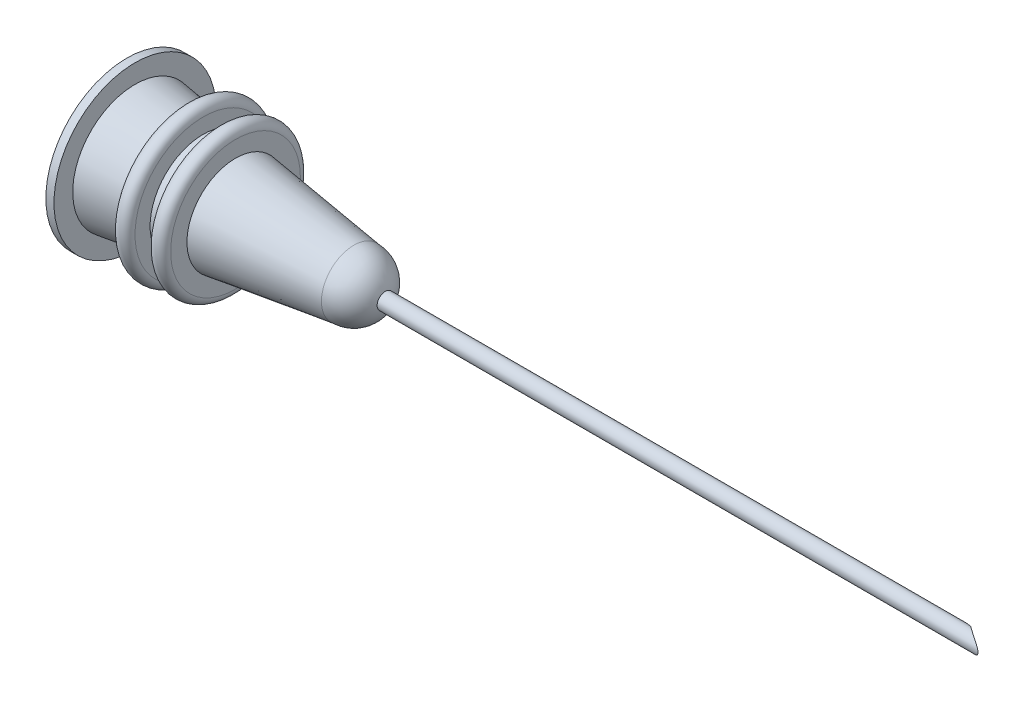
ISO-10303-21;
HEADER;
FILE_DESCRIPTION(('STEP AP214'),'2;1');
FILE_NAME('part.step','',(''),(''),'','','');
FILE_SCHEMA(('AUTOMOTIVE_DESIGN { 1 0 10303 214 1 1 1 1 }'));
ENDSEC;
DATA;
#1=APPLICATION_CONTEXT('core data for automotive mechanical design processes');
#2=APPLICATION_PROTOCOL_DEFINITION('international standard','automotive_design',2000,#1);
#3=PRODUCT_CONTEXT('',#1,'mechanical');
#4=PRODUCT('Part','Part','',(#3));
#5=PRODUCT_RELATED_PRODUCT_CATEGORY('part','',(#4));
#6=PRODUCT_DEFINITION_FORMATION('','',#4);
#7=PRODUCT_DEFINITION_CONTEXT('part definition',#1,'design');
#8=PRODUCT_DEFINITION('design','',#6,#7);
#9=PRODUCT_DEFINITION_SHAPE('','',#8);
#10=(LENGTH_UNIT() NAMED_UNIT(*) SI_UNIT(.MILLI.,.METRE.));
#11=(NAMED_UNIT(*) PLANE_ANGLE_UNIT() SI_UNIT($,.RADIAN.));
#12=(NAMED_UNIT(*) SI_UNIT($,.STERADIAN.) SOLID_ANGLE_UNIT());
#13=UNCERTAINTY_MEASURE_WITH_UNIT(LENGTH_MEASURE(1.E-05),#10,'distance_accuracy_value','');
#14=(GEOMETRIC_REPRESENTATION_CONTEXT(3) GLOBAL_UNCERTAINTY_ASSIGNED_CONTEXT((#13)) GLOBAL_UNIT_ASSIGNED_CONTEXT((#10,
#11,#12)) REPRESENTATION_CONTEXT('',''));
#15=CARTESIAN_POINT('',(0.,0.,0.));
#16=DIRECTION('',(0.,0.,1.));
#17=DIRECTION('',(1.,0.,0.));
#18=AXIS2_PLACEMENT_3D('',#15,#16,#17);
#19=CARTESIAN_POINT('',(0.,0.,0.));
#20=DIRECTION('',(0.,0.,1.));
#21=DIRECTION('',(1.,0.,0.));
#22=AXIS2_PLACEMENT_3D('',#19,#20,#21);
#23=SPHERICAL_SURFACE('',#22,2.);
#24=CARTESIAN_POINT('',(0.,0.,0.));
#25=DIRECTION('',(-1.,0.,0.));
#26=DIRECTION('',(0.,0.,1.));
#27=AXIS2_PLACEMENT_3D('',#24,#25,#26);
#28=SPHERICAL_SURFACE('',#27,2.);
#29=CARTESIAN_POINT('',(1.93649167310371,0.,0.));
#30=DIRECTION('',(-1.,0.,0.));
#31=DIRECTION('',(0.,0.,1.));
#32=AXIS2_PLACEMENT_3D('',#29,#30,#31);
#33=CIRCLE('',#32,0.5);
#34=CARTESIAN_POINT('',(1.93649167310371,0.,0.5));
#35=VERTEX_POINT('',#34);
#36=EDGE_CURVE('E98',#35,#35,#33,.F.);
#37=ORIENTED_EDGE('',*,*,#36,.F.);
#38=EDGE_LOOP('',(#37));
#39=FACE_BOUND('',#38,.T.);
#40=CARTESIAN_POINT('',(0.,0.,0.));
#41=DIRECTION('',(1.,0.,0.));
#42=DIRECTION('',(0.,0.,-1.));
#43=AXIS2_PLACEMENT_3D('',#40,#41,#42);
#44=CIRCLE('',#43,2.);
#45=CARTESIAN_POINT('',(0.,0.,-2.));
#46=VERTEX_POINT('',#45);
#47=EDGE_CURVE('E86',#46,#46,#44,.T.);
#48=ORIENTED_EDGE('',*,*,#47,.T.);
#49=EDGE_LOOP('',(#48));
#50=FACE_BOUND('',#49,.T.);
#51=ADVANCED_FACE('F47',(#39,#50),#28,.T.);
#52=CARTESIAN_POINT('',(0.,0.,0.));
#53=DIRECTION('',(-1.,0.,0.));
#54=DIRECTION('',(0.,0.,1.));
#55=AXIS2_PLACEMENT_3D('',#52,#53,#54);
#56=CONICAL_SURFACE('',#55,2.,0.135639606217915);
#57=CARTESIAN_POINT('',(-7.3,0.,0.));
#58=DIRECTION('',(1.,0.,0.));
#59=DIRECTION('',(0.,0.,-1.));
#60=AXIS2_PLACEMENT_3D('',#57,#58,#59);
#61=CIRCLE('',#60,2.99628656012655);
#62=CARTESIAN_POINT('',(-7.3,0.,-2.99628656012655));
#63=VERTEX_POINT('',#62);
#64=EDGE_CURVE('E89',#63,#63,#61,.T.);
#65=ORIENTED_EDGE('',*,*,#64,.T.);
#66=EDGE_LOOP('',(#65));
#67=FACE_BOUND('',#66,.T.);
#68=ORIENTED_EDGE('',*,*,#47,.F.);
#69=EDGE_LOOP('',(#68));
#70=FACE_BOUND('',#69,.T.);
#71=ADVANCED_FACE('F176',(#67,#70),#56,.T.);
#72=CARTESIAN_POINT('',(-7.3,4.,0.));
#73=DIRECTION('',(1.,0.,0.));
#74=DIRECTION('',(0.,0.,-1.));
#75=AXIS2_PLACEMENT_3D('',#72,#73,#74);
#76=PLANE('',#75);
#77=CARTESIAN_POINT('',(-7.3,0.,0.));
#78=DIRECTION('',(1.,0.,0.));
#79=DIRECTION('',(0.,0.,-1.));
#80=AXIS2_PLACEMENT_3D('',#77,#78,#79);
#81=CIRCLE('',#80,4.);
#82=CARTESIAN_POINT('',(-7.3,0.,-4.));
#83=VERTEX_POINT('',#82);
#84=EDGE_CURVE('E191',#83,#83,#81,.T.);
#85=ORIENTED_EDGE('',*,*,#84,.T.);
#86=EDGE_LOOP('',(#85));
#87=FACE_BOUND('',#86,.T.);
#88=ORIENTED_EDGE('',*,*,#64,.F.);
#89=EDGE_LOOP('',(#88));
#90=FACE_BOUND('',#89,.T.);
#91=ADVANCED_FACE('F173',(#87,#90),#76,.T.);
#92=CARTESIAN_POINT('',(-7.8,0.,0.));
#93=DIRECTION('',(1.,0.,0.));
#94=DIRECTION('',(0.,0.,-1.));
#95=AXIS2_PLACEMENT_3D('',#92,#93,#94);
#96=TOROIDAL_SURFACE('',#95,4.,0.5);
#97=CARTESIAN_POINT('',(-8.3,0.,0.));
#98=DIRECTION('',(1.,0.,0.));
#99=DIRECTION('',(0.,0.,-1.));
#100=AXIS2_PLACEMENT_3D('',#97,#98,#99);
#101=CIRCLE('',#100,4.);
#102=CARTESIAN_POINT('',(-8.3,0.,-4.));
#103=VERTEX_POINT('',#102);
#104=EDGE_CURVE('E195',#103,#103,#101,.T.);
#105=ORIENTED_EDGE('',*,*,#104,.T.);
#106=EDGE_LOOP('',(#105));
#107=FACE_BOUND('',#106,.T.);
#108=ORIENTED_EDGE('',*,*,#84,.F.);
#109=EDGE_LOOP('',(#108));
#110=FACE_BOUND('',#109,.T.);
#111=ADVANCED_FACE('F169',(#107,#110),#96,.T.);
#112=CARTESIAN_POINT('',(-8.3,4.,0.));
#113=DIRECTION('',(-1.,0.,0.));
#114=DIRECTION('',(0.,0.,1.));
#115=AXIS2_PLACEMENT_3D('',#112,#113,#114);
#116=PLANE('',#115);
#117=CARTESIAN_POINT('',(-8.3,0.,0.));
#118=DIRECTION('',(1.,0.,0.));
#119=DIRECTION('',(0.,0.,-1.));
#120=AXIS2_PLACEMENT_3D('',#117,#118,#119);
#121=CIRCLE('',#120,3.13276417110279);
#122=CARTESIAN_POINT('',(-8.3,0.,-3.13276417110279));
#123=VERTEX_POINT('',#122);
#124=EDGE_CURVE('E201',#123,#123,#121,.T.);
#125=ORIENTED_EDGE('',*,*,#124,.T.);
#126=EDGE_LOOP('',(#125));
#127=FACE_BOUND('',#126,.T.);
#128=ORIENTED_EDGE('',*,*,#104,.F.);
#129=EDGE_LOOP('',(#128));
#130=FACE_BOUND('',#129,.T.);
#131=ADVANCED_FACE('F165',(#127,#130),#116,.T.);
#132=CARTESIAN_POINT('',(-8.3,0.,0.));
#133=DIRECTION('',(-1.,0.,0.));
#134=DIRECTION('',(0.,0.,1.));
#135=AXIS2_PLACEMENT_3D('',#132,#133,#134);
#136=CONICAL_SURFACE('',#135,3.13276417110279,0.135639606217915);
#137=CARTESIAN_POINT('',(-9.3,0.,0.));
#138=DIRECTION('',(1.,0.,0.));
#139=DIRECTION('',(0.,0.,-1.));
#140=AXIS2_PLACEMENT_3D('',#137,#138,#139);
#141=CIRCLE('',#140,3.26924178207903);
#142=CARTESIAN_POINT('',(-9.3,0.,-3.26924178207903));
#143=VERTEX_POINT('',#142);
#144=EDGE_CURVE('E205',#143,#143,#141,.T.);
#145=ORIENTED_EDGE('',*,*,#144,.T.);
#146=EDGE_LOOP('',(#145));
#147=FACE_BOUND('',#146,.T.);
#148=ORIENTED_EDGE('',*,*,#124,.F.);
#149=EDGE_LOOP('',(#148));
#150=FACE_BOUND('',#149,.T.);
#151=ADVANCED_FACE('F161',(#147,#150),#136,.T.);
#152=CARTESIAN_POINT('',(-9.3,4.2,0.));
#153=DIRECTION('',(1.,0.,0.));
#154=DIRECTION('',(0.,0.,-1.));
#155=AXIS2_PLACEMENT_3D('',#152,#153,#154);
#156=PLANE('',#155);
#157=CARTESIAN_POINT('',(-9.3,0.,0.));
#158=DIRECTION('',(1.,0.,0.));
#159=DIRECTION('',(0.,0.,-1.));
#160=AXIS2_PLACEMENT_3D('',#157,#158,#159);
#161=CIRCLE('',#160,4.2);
#162=CARTESIAN_POINT('',(-9.3,0.,-4.2));
#163=VERTEX_POINT('',#162);
#164=EDGE_CURVE('E209',#163,#163,#161,.T.);
#165=ORIENTED_EDGE('',*,*,#164,.T.);
#166=EDGE_LOOP('',(#165));
#167=FACE_BOUND('',#166,.T.);
#168=ORIENTED_EDGE('',*,*,#144,.F.);
#169=EDGE_LOOP('',(#168));
#170=FACE_BOUND('',#169,.T.);
#171=ADVANCED_FACE('F157',(#167,#170),#156,.T.);
#172=CARTESIAN_POINT('',(-9.8,0.,0.));
#173=DIRECTION('',(1.,0.,0.));
#174=DIRECTION('',(0.,0.,-1.));
#175=AXIS2_PLACEMENT_3D('',#172,#173,#174);
#176=TOROIDAL_SURFACE('',#175,4.2,0.5);
#177=CARTESIAN_POINT('',(-10.3,0.,0.));
#178=DIRECTION('',(1.,0.,0.));
#179=DIRECTION('',(0.,0.,-1.));
#180=AXIS2_PLACEMENT_3D('',#177,#178,#179);
#181=CIRCLE('',#180,4.2);
#182=CARTESIAN_POINT('',(-10.3,0.,-4.2));
#183=VERTEX_POINT('',#182);
#184=EDGE_CURVE('E213',#183,#183,#181,.T.);
#185=ORIENTED_EDGE('',*,*,#184,.T.);
#186=EDGE_LOOP('',(#185));
#187=FACE_BOUND('',#186,.T.);
#188=ORIENTED_EDGE('',*,*,#164,.F.);
#189=EDGE_LOOP('',(#188));
#190=FACE_BOUND('',#189,.T.);
#191=ADVANCED_FACE('F153',(#187,#190),#176,.T.);
#192=CARTESIAN_POINT('',(-10.3,4.2,0.));
#193=DIRECTION('',(-1.,0.,0.));
#194=DIRECTION('',(0.,0.,1.));
#195=AXIS2_PLACEMENT_3D('',#192,#193,#194);
#196=PLANE('',#195);
#197=CARTESIAN_POINT('',(-10.3,0.,0.));
#198=DIRECTION('',(1.,0.,0.));
#199=DIRECTION('',(0.,0.,-1.));
#200=AXIS2_PLACEMENT_3D('',#197,#198,#199);
#201=CIRCLE('',#200,3.40571939305527);
#202=CARTESIAN_POINT('',(-10.3,0.,-3.40571939305527));
#203=VERTEX_POINT('',#202);
#204=EDGE_CURVE('E217',#203,#203,#201,.T.);
#205=ORIENTED_EDGE('',*,*,#204,.T.);
#206=EDGE_LOOP('',(#205));
#207=FACE_BOUND('',#206,.T.);
#208=ORIENTED_EDGE('',*,*,#184,.F.);
#209=EDGE_LOOP('',(#208));
#210=FACE_BOUND('',#209,.T.);
#211=ADVANCED_FACE('F149',(#207,#210),#196,.T.);
#212=CARTESIAN_POINT('',(-10.3,0.,0.));
#213=DIRECTION('',(-1.,0.,0.));
#214=DIRECTION('',(0.,0.,1.));
#215=AXIS2_PLACEMENT_3D('',#212,#213,#214);
#216=CONICAL_SURFACE('',#215,3.40571939305527,0.135639606217915);
#217=CARTESIAN_POINT('',(-13.5,0.,0.));
#218=DIRECTION('',(1.,0.,0.));
#219=DIRECTION('',(0.,0.,-1.));
#220=AXIS2_PLACEMENT_3D('',#217,#218,#219);
#221=CIRCLE('',#220,3.84244774817923);
#222=CARTESIAN_POINT('',(-13.5,0.,-3.84244774817923));
#223=VERTEX_POINT('',#222);
#224=EDGE_CURVE('E221',#223,#223,#221,.T.);
#225=ORIENTED_EDGE('',*,*,#224,.T.);
#226=EDGE_LOOP('',(#225));
#227=FACE_BOUND('',#226,.T.);
#228=ORIENTED_EDGE('',*,*,#204,.F.);
#229=EDGE_LOOP('',(#228));
#230=FACE_BOUND('',#229,.T.);
#231=ADVANCED_FACE('F145',(#227,#230),#216,.T.);
#232=CARTESIAN_POINT('',(-13.5,3.84244774817923,0.));
#233=DIRECTION('',(1.,0.,0.));
#234=DIRECTION('',(0.,0.,-1.));
#235=AXIS2_PLACEMENT_3D('',#232,#233,#234);
#236=PLANE('',#235);
#237=CARTESIAN_POINT('',(-13.5,0.,0.));
#238=DIRECTION('',(1.,0.,0.));
#239=DIRECTION('',(0.,0.,-1.));
#240=AXIS2_PLACEMENT_3D('',#237,#238,#239);
#241=CIRCLE('',#240,5.);
#242=CARTESIAN_POINT('',(-13.5,0.,-5.));
#243=VERTEX_POINT('',#242);
#244=EDGE_CURVE('E225',#243,#243,#241,.T.);
#245=ORIENTED_EDGE('',*,*,#244,.T.);
#246=EDGE_LOOP('',(#245));
#247=FACE_BOUND('',#246,.T.);
#248=ORIENTED_EDGE('',*,*,#224,.F.);
#249=EDGE_LOOP('',(#248));
#250=FACE_BOUND('',#249,.T.);
#251=ADVANCED_FACE('F141',(#247,#250),#236,.T.);
#252=CARTESIAN_POINT('',(0.,0.,0.));
#253=DIRECTION('',(1.,0.,0.));
#254=DIRECTION('',(0.,0.,-1.));
#255=AXIS2_PLACEMENT_3D('',#252,#253,#254);
#256=CYLINDRICAL_SURFACE('',#255,5.);
#257=CARTESIAN_POINT('',(-14.,0.,0.));
#258=DIRECTION('',(1.,0.,0.));
#259=DIRECTION('',(0.,0.,-1.));
#260=AXIS2_PLACEMENT_3D('',#257,#258,#259);
#261=CIRCLE('',#260,5.);
#262=CARTESIAN_POINT('',(-14.,0.,-5.));
#263=VERTEX_POINT('',#262);
#264=EDGE_CURVE('E229',#263,#263,#261,.T.);
#265=ORIENTED_EDGE('',*,*,#264,.T.);
#266=EDGE_LOOP('',(#265));
#267=FACE_BOUND('',#266,.T.);
#268=ORIENTED_EDGE('',*,*,#244,.F.);
#269=EDGE_LOOP('',(#268));
#270=FACE_BOUND('',#269,.T.);
#271=ADVANCED_FACE('F137',(#267,#270),#256,.T.);
#272=CARTESIAN_POINT('',(-14.,5.,0.));
#273=DIRECTION('',(-1.,0.,0.));
#274=DIRECTION('',(0.,0.,1.));
#275=AXIS2_PLACEMENT_3D('',#272,#273,#274);
#276=PLANE('',#275);
#277=CARTESIAN_POINT('',(-14.,0.,0.));
#278=DIRECTION('',(1.,0.,0.));
#279=DIRECTION('',(0.,0.,-1.));
#280=AXIS2_PLACEMENT_3D('',#277,#278,#279);
#281=CIRCLE('',#280,3.15373397735065);
#282=CARTESIAN_POINT('',(-14.,0.,-3.15373397735065));
#283=VERTEX_POINT('',#282);
#284=EDGE_CURVE('E233',#283,#283,#281,.T.);
#285=ORIENTED_EDGE('',*,*,#284,.T.);
#286=EDGE_LOOP('',(#285));
#287=FACE_BOUND('',#286,.T.);
#288=ORIENTED_EDGE('',*,*,#264,.F.);
#289=EDGE_LOOP('',(#288));
#290=FACE_BOUND('',#289,.T.);
#291=ADVANCED_FACE('F133',(#287,#290),#276,.T.);
#292=CARTESIAN_POINT('',(-14.,0.,0.));
#293=DIRECTION('',(-1.,0.,0.));
#294=DIRECTION('',(0.,0.,1.));
#295=AXIS2_PLACEMENT_3D('',#292,#293,#294);
#296=CONICAL_SURFACE('',#295,3.15373397735065,0.135639606217915);
#297=CARTESIAN_POINT('',(-1.,0.,0.));
#298=DIRECTION('',(1.,0.,0.));
#299=DIRECTION('',(0.,0.,-1.));
#300=AXIS2_PLACEMENT_3D('',#297,#298,#299);
#301=CIRCLE('',#300,1.37952503465953);
#302=CARTESIAN_POINT('',(-1.,0.,-1.37952503465953));
#303=VERTEX_POINT('',#302);
#304=EDGE_CURVE('E236',#303,#303,#301,.T.);
#305=ORIENTED_EDGE('',*,*,#304,.T.);
#306=EDGE_LOOP('',(#305));
#307=FACE_BOUND('',#306,.T.);
#308=ORIENTED_EDGE('',*,*,#284,.F.);
#309=EDGE_LOOP('',(#308));
#310=FACE_BOUND('',#309,.T.);
#311=ADVANCED_FACE('F129',(#307,#310),#296,.F.);
#312=CARTESIAN_POINT('',(-1.,1.37952503465953,0.));
#313=DIRECTION('',(-1.,0.,0.));
#314=DIRECTION('',(0.,0.,1.));
#315=AXIS2_PLACEMENT_3D('',#312,#313,#314);
#316=PLANE('',#315);
#317=ORIENTED_EDGE('',*,*,#304,.F.);
#318=EDGE_LOOP('',(#317));
#319=FACE_BOUND('',#318,.T.);
#320=CARTESIAN_POINT('',(-1.,0.,0.));
#321=DIRECTION('',(-1.,0.,0.));
#322=DIRECTION('',(0.,0.,1.));
#323=AXIS2_PLACEMENT_3D('',#320,#321,#322);
#324=CIRCLE('',#323,0.375);
#325=CARTESIAN_POINT('',(-1.,0.,0.375));
#326=VERTEX_POINT('',#325);
#327=EDGE_CURVE('E115',#326,#326,#324,.T.);
#328=ORIENTED_EDGE('',*,*,#327,.F.);
#329=EDGE_LOOP('',(#328));
#330=FACE_BOUND('',#329,.T.);
#331=ADVANCED_FACE('F124',(#319,#330),#316,.T.);
#332=CARTESIAN_POINT('',(39.,0.,0.));
#333=DIRECTION('',(-1.,0.,0.));
#334=DIRECTION('',(0.,0.,1.));
#335=AXIS2_PLACEMENT_3D('',#332,#333,#334);
#336=CYLINDRICAL_SURFACE('',#335,0.5);
#337=CARTESIAN_POINT('',(39.,-0.5,0.));
#338=CARTESIAN_POINT('',(38.9583904464747,-0.499994803298946,-7.99673521089671E-08));
#339=CARTESIAN_POINT('',(38.9167847254722,-0.500000699921479,-0.000742115513358594));
#340=CARTESIAN_POINT('',(38.8336253744731,-0.499989394064269,-0.00370895092813826));
#341=CARTESIAN_POINT('',(38.7920717455169,-0.499972191130249,-0.00593377995719229));
#342=CARTESIAN_POINT('',(38.6674118848881,-0.499817818955422,-0.0148411402855794));
#343=CARTESIAN_POINT('',(38.5844535810992,-0.499577585148702,-0.0237565455544003));
#344=CARTESIAN_POINT('',(38.4169432825375,-0.497856255421235,-0.0478382860272766));
#345=CARTESIAN_POINT('',(38.3324174936529,-0.496338385050073,-0.0631830287886607));
#346=CARTESIAN_POINT('',(38.1648805450954,-0.490255252748027,-0.100013123175821));
#347=CARTESIAN_POINT('',(38.0818676852382,-0.485693659984474,-0.121491063501163));
#348=CARTESIAN_POINT('',(37.9596030795196,-0.474562469753925,-0.157941447869739));
#349=CARTESIAN_POINT('',(37.9194849914223,-0.470180555173614,-0.170698035666228));
#350=CARTESIAN_POINT('',(37.8399333663788,-0.459536871384369,-0.197575650367584));
#351=CARTESIAN_POINT('',(37.8005000872512,-0.45327440974508,-0.21169717855188));
#352=CARTESIAN_POINT('',(37.722915270225,-0.438364892673408,-0.241049302382515));
#353=CARTESIAN_POINT('',(37.6847553892127,-0.429739812563383,-0.256268768910112));
#354=CARTESIAN_POINT('',(37.6097252192644,-0.409356892287562,-0.287713508448095));
#355=CARTESIAN_POINT('',(37.5728534926489,-0.39760267962269,-0.303937600222462));
#356=CARTESIAN_POINT('',(37.5128661440604,-0.374549876832646,-0.331540481008057));
#357=CARTESIAN_POINT('',(37.4892365292266,-0.364387986342912,-0.342745772960855));
#358=CARTESIAN_POINT('',(37.4430556379542,-0.341816851227132,-0.365261804181128));
#359=CARTESIAN_POINT('',(37.4205059784337,-0.329404362252174,-0.376572673019891));
#360=CARTESIAN_POINT('',(37.3768046784772,-0.301783420635364,-0.399057398946937));
#361=CARTESIAN_POINT('',(37.3556647263046,-0.286554794683712,-0.410229603733906));
#362=CARTESIAN_POINT('',(37.3157151122843,-0.252837038529341,-0.431825297276893));
#363=CARTESIAN_POINT('',(37.2969006298143,-0.234354852566207,-0.442250315403696));
#364=CARTESIAN_POINT('',(37.2687262244161,-0.200780968946557,-0.458149245183976));
#365=CARTESIAN_POINT('',(37.2583587285163,-0.186758291166878,-0.464081033678554));
#366=CARTESIAN_POINT('',(37.239560520521,-0.157093393318153,-0.474942938073182));
#367=CARTESIAN_POINT('',(37.2311291954037,-0.141451688140049,-0.479873370960625));
#368=CARTESIAN_POINT('',(37.2166666265028,-0.108480043032767,-0.488390104026612));
#369=CARTESIAN_POINT('',(37.2106663897658,-0.0911315991674563,-0.491959007160743));
#370=CARTESIAN_POINT('',(37.2018019565138,-0.0553843135358398,-0.497249310117112));
#371=CARTESIAN_POINT('',(37.1989322410427,-0.0369873806716421,-0.498973961159396));
#372=CARTESIAN_POINT('',(37.1968218353719,-0.00270346847246074,-0.500241795186489));
#373=CARTESIAN_POINT('',(37.1971000086102,0.0131445987378425,-0.500074206118567));
#374=CARTESIAN_POINT('',(37.2001189825966,0.0445176814328982,-0.498261940402623));
#375=CARTESIAN_POINT('',(37.2028601919027,0.0600426428850769,-0.496617018700896));
#376=CARTESIAN_POINT('',(37.2103117895527,0.0892841279112462,-0.492171377414631));
#377=CARTESIAN_POINT('',(37.2148766121181,0.10305196613142,-0.48945626107802));
#378=CARTESIAN_POINT('',(37.2256655709193,0.129678971269589,-0.48308490046222));
#379=CARTESIAN_POINT('',(37.2318901059111,0.142537918880694,-0.479428430024365));
#380=CARTESIAN_POINT('',(37.2496322634132,0.174246374316899,-0.469097838659774));
#381=CARTESIAN_POINT('',(37.262150493485,0.192361180484079,-0.461887875517415));
#382=CARTESIAN_POINT('',(37.28960869251,0.226105466199443,-0.446344293853159));
#383=CARTESIAN_POINT('',(37.3045554639449,0.241727713000594,-0.438007530460692));
#384=CARTESIAN_POINT('',(37.3462442427515,0.27994699460307,-0.415206129522202));
#385=CARTESIAN_POINT('',(37.3744316882328,0.300642256121808,-0.400222814352508));
#386=CARTESIAN_POINT('',(37.4335560090162,0.337223128487307,-0.369925059956415));
#387=CARTESIAN_POINT('',(37.4644987112064,0.353098217328216,-0.35460997341866));
#388=CARTESIAN_POINT('',(37.5275346471119,0.380827680333681,-0.32461972810918));
#389=CARTESIAN_POINT('',(37.5595933290358,0.392754926319961,-0.309937908317914));
#390=CARTESIAN_POINT('',(37.6249231613908,0.413789230212495,-0.281235941951396));
#391=CARTESIAN_POINT('',(37.658195466676,0.422893519250126,-0.267216456369516));
#392=CARTESIAN_POINT('',(37.7594754308689,0.446930135802758,-0.226410289778932));
#393=CARTESIAN_POINT('',(37.828801570503,0.458530024018995,-0.200945266527625));
#394=CARTESIAN_POINT('',(37.975398446559,0.476978485461339,-0.15236343615748));
#395=CARTESIAN_POINT('',(38.0528461316098,0.483343881777793,-0.129625755155971));
#396=CARTESIAN_POINT('',(38.2093982866884,0.492351913364939,-0.0895036853086109));
#397=CARTESIAN_POINT('',(38.2885045391685,0.494990310631255,-0.0721254082060827));
#398=CARTESIAN_POINT('',(38.4476853774396,0.498371474445396,-0.04290661281898));
#399=CARTESIAN_POINT('',(38.5277590577391,0.499115893607073,-0.0310612740754833));
#400=CARTESIAN_POINT('',(38.688486186485,0.499914979986723,-0.0129536418559289));
#401=CARTESIAN_POINT('',(38.769139156733,0.499970162457228,-0.0066871810345249));
#402=CARTESIAN_POINT('',(38.8749130413675,0.499995660635806,-0.00214622440247774));
#403=CARTESIAN_POINT('',(38.8999422888125,0.499998263581664,-0.00134085138135894));
#404=CARTESIAN_POINT('',(38.9499804378618,0.500000442140695,-0.000268132540508739));
#405=CARTESIAN_POINT('',(38.9749893248101,0.500000021603135,-1.03172216817782E-07));
#406=CARTESIAN_POINT('',(39.,0.5,0.));
#407=B_SPLINE_CURVE_WITH_KNOTS('',3,(#337,#338,#339,#340,#341,#342,#343,#344,#345,#346,#347,
#348,#349,#350,#351,#352,#353,#354,#355,#356,#357,#358,#359,#360,#361,#362,#363,#364,#365,#366,
#367,#368,#369,#370,#371,#372,#373,#374,#375,#376,#377,#378,#379,#380,#381,#382,#383,#384,#385,
#386,#387,#388,#389,#390,#391,#392,#393,#394,#395,#396,#397,#398,#399,#400,#401,#402,#403,#404,
#405,#406),.UNSPECIFIED.,.F.,.F.,(4,2,2,2,2,2,2,2,2,2,2,2,2,2,2,2,2,2,2,2,2,2,2,2,2,2,2,2,2,2,2,
2,2,2,4),(0.,0.124814384042121,0.249631222728082,0.499704596565306,0.7572322154963,
1.01444994778906,1.14137187366669,1.26834059049328,1.39416624727194,1.51984666892834,
1.60393189119591,1.68813930435156,1.77297510464742,1.85763198366321,1.91273336331845,
1.96781727289549,2.02358315965481,2.0792505741994,2.12654068640839,2.17383864435079,
2.21794082486962,2.26205361076341,2.33116467754335,2.40047277570449,2.51396061966746,
2.62769444530125,2.73919358516789,2.85080174439054,3.07452291406224,3.3171106682169,
3.55997404966028,3.80262544488738,4.045095430394,4.12021806659986,4.19524507938975),.UNSPECIFIED.);
#408=CARTESIAN_POINT('',(37.8614010421319,-0.462337439792473,-0.190378811232082));
#409=VERTEX_POINT('',#408);
#410=CARTESIAN_POINT('',(37.8614010421319,0.462337439792474,-0.190378811232083));
#411=VERTEX_POINT('',#410);
#412=EDGE_CURVE('E107',#409,#411,#407,.T.);
#413=ORIENTED_EDGE('',*,*,#412,.F.);
#414=CARTESIAN_POINT('',(39.,0.,0.5));
#415=CARTESIAN_POINT('',(39.0000005124618,-0.0125909528909834,0.500000207355728));
#416=CARTESIAN_POINT('',(38.9988973767319,-0.025180397369269,0.499519234809843));
#417=CARTESIAN_POINT('',(38.9946350092743,-0.0499385012717411,0.497655349963925));
#418=CARTESIAN_POINT('',(38.9914732444924,-0.0621066228241086,0.496271326494273));
#419=CARTESIAN_POINT('',(38.9823563092796,-0.0889280195617155,0.492262479074227));
#420=CARTESIAN_POINT('',(38.9758772393713,-0.103364580234846,0.48940345588389));
#421=CARTESIAN_POINT('',(38.9609393218666,-0.13093507860832,0.482760971508321));
#422=CARTESIAN_POINT('',(38.9524758727961,-0.144065886120112,0.478975360797057));
#423=CARTESIAN_POINT('',(38.9275153352082,-0.178239045217895,0.467710472161099));
#424=CARTESIAN_POINT('',(38.9096659117157,-0.198054079829813,0.459553038460227));
#425=CARTESIAN_POINT('',(38.8717810342524,-0.234766055902741,0.441927259547519));
#426=CARTESIAN_POINT('',(38.851739327943,-0.251654276504805,0.432455143089352));
#427=CARTESIAN_POINT('',(38.8092878959211,-0.283945989411704,0.412017024766675));
#428=CARTESIAN_POINT('',(38.7868090098062,-0.299223979781191,0.400998548477213));
#429=CARTESIAN_POINT('',(38.7409833987655,-0.327694695149542,0.378086153442413));
#430=CARTESIAN_POINT('',(38.7176358116827,-0.34088527638571,0.366191352847969));
#431=CARTESIAN_POINT('',(38.6467011525839,-0.377846909625647,0.329319170444028));
#432=CARTESIAN_POINT('',(38.5983064931673,-0.398948572353165,0.303194218455586));
#433=CARTESIAN_POINT('',(38.5116434295749,-0.43115045563295,0.25447255382657));
#434=CARTESIAN_POINT('',(38.4735100250777,-0.443430906903333,0.232378654642423));
#435=CARTESIAN_POINT('',(38.3971104600884,-0.464506651404059,0.186726812587654));
#436=CARTESIAN_POINT('',(38.3588442312142,-0.473299749030292,0.163167958156983));
#437=CARTESIAN_POINT('',(38.282573326214,-0.487302082271066,0.114760315750183));
#438=CARTESIAN_POINT('',(38.2445682950705,-0.492517980778311,0.0899140191581733));
#439=CARTESIAN_POINT('',(38.1690259956952,-0.499133481519282,0.0390331707596711));
#440=CARTESIAN_POINT('',(38.1314886539613,-0.500533691153066,0.0129988087461952));
#441=CARTESIAN_POINT('',(38.0482455780525,-0.498927562939486,-0.046445257302097));
#442=CARTESIAN_POINT('',(38.0027441156513,-0.494781695664623,-0.0801241456553621));
#443=CARTESIAN_POINT('',(37.9137717109363,-0.478773825724017,-0.148326395128305));
#444=CARTESIAN_POINT('',(37.8702974622003,-0.466924894940706,-0.182848230447304));
#445=CARTESIAN_POINT('',(37.7990873753449,-0.438752162381983,-0.241272096008405));
#446=CARTESIAN_POINT('',(37.7705107135906,-0.424801054172238,-0.265284381245067));
#447=CARTESIAN_POINT('',(37.7157304162491,-0.391519319774967,-0.312315004782395));
#448=CARTESIAN_POINT('',(37.6895233727716,-0.372196587332175,-0.33533474475003));
#449=CARTESIAN_POINT('',(37.6475525791964,-0.333831173526177,-0.372905362585786));
#450=CARTESIAN_POINT('',(37.6309360033177,-0.316265799889608,-0.388005428325767));
#451=CARTESIAN_POINT('',(37.600087878209,-0.277849988670347,-0.416374105719039));
#452=CARTESIAN_POINT('',(37.5858529458001,-0.257004294023518,-0.429645310499885));
#453=CARTESIAN_POINT('',(37.5630874986448,-0.21666810339116,-0.4510709905684));
#454=CARTESIAN_POINT('',(37.5539856241199,-0.197764164466051,-0.4597171666662));
#455=CARTESIAN_POINT('',(37.5381924423697,-0.158140254410441,-0.474805195656867));
#456=CARTESIAN_POINT('',(37.5314998568906,-0.13742125354202,-0.481248217347275));
#457=CARTESIAN_POINT('',(37.520893337094,-0.0944708469397574,-0.491493306016106));
#458=CARTESIAN_POINT('',(37.5170001579987,-0.0722294566734652,-0.495275641878065));
#459=CARTESIAN_POINT('',(37.5123694610005,-0.0271168805342251,-0.499777274653022));
#460=CARTESIAN_POINT('',(37.5116300022618,-0.00424609072665259,-0.500498455434737));
#461=CARTESIAN_POINT('',(37.5132539771268,0.0385080169191387,-0.498918024966597));
#462=CARTESIAN_POINT('',(37.5152553379314,0.0584201718955551,-0.496969128003496));
#463=CARTESIAN_POINT('',(37.5216131970898,0.0974963358523556,-0.490801109770033));
#464=CARTESIAN_POINT('',(37.5259697582255,0.116660324874539,-0.486581927981493));
#465=CARTESIAN_POINT('',(37.5368657837836,0.154020331730885,-0.476087301402336));
#466=CARTESIAN_POINT('',(37.5434308295209,0.172201964800404,-0.469787776017919));
#467=CARTESIAN_POINT('',(37.5584250557673,0.207060888106526,-0.455501199935989));
#468=CARTESIAN_POINT('',(37.5668550894069,0.223737484939516,-0.447513377009064));
#469=CARTESIAN_POINT('',(37.589714841899,0.263080275449752,-0.42603326608648));
#470=CARTESIAN_POINT('',(37.6050799191378,0.284768630916899,-0.411741513891854));
#471=CARTESIAN_POINT('',(37.6383818306927,0.324503752948605,-0.381219503320736));
#472=CARTESIAN_POINT('',(37.6563246044694,0.342541870930251,-0.364984782841594));
#473=CARTESIAN_POINT('',(37.7025210143635,0.382444080092323,-0.323858118593175));
#474=CARTESIAN_POINT('',(37.7318113331719,0.402441902171908,-0.298327089514046));
#475=CARTESIAN_POINT('',(37.7929800658604,0.436205873847514,-0.246347043710285));
#476=CARTESIAN_POINT('',(37.8248621657757,0.449962958336858,-0.219896751308745));
#477=CARTESIAN_POINT('',(37.9078283958452,0.478091109284276,-0.152866087287852));
#478=CARTESIAN_POINT('',(37.9600964867726,0.488887498694186,-0.112262309511031));
#479=CARTESIAN_POINT('',(38.0670020784229,0.500558963882678,-0.0326366728156283));
#480=CARTESIAN_POINT('',(38.1216472997683,0.501398843337304,0.00637908857633488));
#481=CARTESIAN_POINT('',(38.2144319440119,0.495765744064802,0.0698560734920381));
#482=CARTESIAN_POINT('',(38.2522738905908,0.491540865370263,0.0949887438968994));
#483=CARTESIAN_POINT('',(38.3282187737208,0.479490713597583,0.143962449973586));
#484=CARTESIAN_POINT('',(38.36632169173,0.471665693745094,0.167803576357838));
#485=CARTESIAN_POINT('',(38.4423634200552,0.452582378861434,0.21398891750308));
#486=CARTESIAN_POINT('',(38.480302304127,0.441337233440525,0.236338472559681));
#487=CARTESIAN_POINT('',(38.5558126738647,0.415339597052174,0.279515004247105));
#488=CARTESIAN_POINT('',(38.593384455557,0.400590225866142,0.300343313786823));
#489=CARTESIAN_POINT('',(38.6559590907704,0.372489684595171,0.334018864297576));
#490=CARTESIAN_POINT('',(38.6811861567437,0.360166517670902,0.347310237810937));
#491=CARTESIAN_POINT('',(38.7311002530146,0.33340045808994,0.373081913110669));
#492=CARTESIAN_POINT('',(38.7557846268843,0.318949032528365,0.385558643647925));
#493=CARTESIAN_POINT('',(38.8111139461936,0.283029235472358,0.412976311430089));
#494=CARTESIAN_POINT('',(38.841400607675,0.260743111463108,0.427576356855478));
#495=CARTESIAN_POINT('',(38.8982701147684,0.210646212952149,0.454348852429626));
#496=CARTESIAN_POINT('',(38.9248834069582,0.182886151744351,0.466541670631288));
#497=CARTESIAN_POINT('',(38.9550180833392,0.140092279107698,0.480113210586274));
#498=CARTESIAN_POINT('',(38.962358149907,0.128406724746649,0.483392844161234));
#499=CARTESIAN_POINT('',(38.975475938997,0.104007762155108,0.489223989864512));
#500=CARTESIAN_POINT('',(38.9812549401945,0.0912952063029823,0.491776098007413));
#501=CARTESIAN_POINT('',(38.9904546486923,0.0656917407073116,0.495824904565758));
#502=CARTESIAN_POINT('',(38.9939902333964,0.0528515671350377,0.497373123463732));
#503=CARTESIAN_POINT('',(38.9987608387592,0.026673156762745,0.499459771770725));
#504=CARTESIAN_POINT('',(38.9999994572251,0.0133357323105379,0.499999780378776));
#505=CARTESIAN_POINT('',(39.,0.,0.5));
#506=B_SPLINE_CURVE_WITH_KNOTS('',3,(#414,#415,#416,#417,#418,#419,#420,#421,#422,#423,#424,
#425,#426,#427,#428,#429,#430,#431,#432,#433,#434,#435,#436,#437,#438,#439,#440,#441,#442,#443,
#444,#445,#446,#447,#448,#449,#450,#451,#452,#453,#454,#455,#456,#457,#458,#459,#460,#461,#462,
#463,#464,#465,#466,#467,#468,#469,#470,#471,#472,#473,#474,#475,#476,#477,#478,#479,#480,#481,
#482,#483,#484,#485,#486,#487,#488,#489,#490,#491,#492,#493,#494,#495,#496,#497,#498,#499,#500,
#501,#502,#503,#504,#505),.UNSPECIFIED.,.T.,.F.,(4,2,2,2,2,2,2,2,2,2,2,2,2,2,2,2,2,2,2,2,2,2,2,
2,2,2,2,2,2,2,2,2,2,2,2,2,2,2,2,2,2,2,2,2,2,4),(0.,0.0377171393239235,0.0754807758880128,
0.123446598823008,0.171524766870326,0.254722773433654,0.33816457033518,0.426012773857266,
0.513950619770759,0.690155197571436,0.827274241281504,0.964479477289659,1.10142845559558,
1.23835563241803,1.40818053954058,1.57771800818296,1.69692531488621,1.81595836096603,
1.90120441387978,1.98632832532865,2.05414059542094,2.12191683434377,2.1901905356779,
2.25842221452333,2.31845737033666,2.37849412656512,2.43925172309345,2.50003717059807,
2.590063563213,2.68030082221581,2.81067025081278,2.94122844844337,3.14131553751746,
3.34210972563429,3.47882789418195,3.61553644775786,3.75172589353518,3.88779454241786,
3.98091668391423,4.07442289530074,4.19516734257764,4.31484167914277,4.35728560279303,
4.39969465428997,4.43970555935149,4.47965374102591),.UNSPECIFIED.);
#507=EDGE_CURVE('E62',#411,#409,#506,.T.);
#508=ORIENTED_EDGE('',*,*,#507,.F.);
#509=EDGE_LOOP('',(#413,#508));
#510=FACE_BOUND('',#509,.T.);
#511=ORIENTED_EDGE('',*,*,#36,.T.);
#512=EDGE_LOOP('',(#511));
#513=FACE_BOUND('',#512,.T.);
#514=ADVANCED_FACE('F120',(#510,#513),#336,.T.);
#515=CARTESIAN_POINT('',(39.,0.,0.));
#516=DIRECTION('',(-1.,0.,0.));
#517=DIRECTION('',(0.,0.,1.));
#518=AXIS2_PLACEMENT_3D('',#515,#516,#517);
#519=CYLINDRICAL_SURFACE('',#518,0.375);
#520=CARTESIAN_POINT('',(39.,-0.375,0.));
#521=CARTESIAN_POINT('',(38.9687172882148,-0.374997730410719,1.55684874962942E-08));
#522=CARTESIAN_POINT('',(38.9374360239019,-0.375000271117309,-0.000419420066799191));
#523=CARTESIAN_POINT('',(38.874896182891,-0.374995508331238,-0.00209668931991857));
#524=CARTESIAN_POINT('',(38.8436376060489,-0.374988204901666,-0.0033545175646256));
#525=CARTESIAN_POINT('',(38.7498906909202,-0.374922307720044,-0.00838668396821064));
#526=CARTESIAN_POINT('',(38.6874655632978,-0.374819686800748,-0.0134197032169252));
#527=CARTESIAN_POINT('',(38.5621598569765,-0.374094934786773,-0.0269151720440407));
#528=CARTESIAN_POINT('',(38.4992840658622,-0.373465997701552,-0.0354217984014894));
#529=CARTESIAN_POINT('',(38.3741390689933,-0.37096224739,-0.0558283461192825));
#530=CARTESIAN_POINT('',(38.3118696256459,-0.369087943871211,-0.0677268780926012));
#531=CARTESIAN_POINT('',(38.1762176334091,-0.362494425679048,-0.0974896777727217));
#532=CARTESIAN_POINT('',(38.1030038738212,-0.357296922874498,-0.116061498129649));
#533=CARTESIAN_POINT('',(37.9948402994412,-0.345062996580087,-0.147231486687494));
#534=CARTESIAN_POINT('',(37.9591485808886,-0.340262792015744,-0.158142346836338));
#535=CARTESIAN_POINT('',(37.88842924391,-0.3286805707061,-0.1809959384025));
#536=CARTESIAN_POINT('',(37.8534012720156,-0.321899642261831,-0.192938100643651));
#537=CARTESIAN_POINT('',(37.7895569449259,-0.306922076587049,-0.215826417103353));
#538=CARTESIAN_POINT('',(37.7606088701963,-0.299099759685882,-0.226646181046268));
#539=CARTESIAN_POINT('',(37.7035658377778,-0.280930804525562,-0.24881628104574));
#540=CARTESIAN_POINT('',(37.6754742867236,-0.270575272616139,-0.260168369953243));
#541=CARTESIAN_POINT('',(37.6204415537864,-0.246374628288589,-0.283212620373679));
#542=CARTESIAN_POINT('',(37.5935207909359,-0.232484682520518,-0.294907299719374));
#543=CARTESIAN_POINT('',(37.5424530670269,-0.200037013049557,-0.317812018894777));
#544=CARTESIAN_POINT('',(37.51828752964,-0.181513618479551,-0.329024941946787));
#545=CARTESIAN_POINT('',(37.4885879956568,-0.151517482910573,-0.343147006404318));
#546=CARTESIAN_POINT('',(37.4807544780891,-0.142741315727479,-0.346912633235461));
#547=CARTESIAN_POINT('',(37.466149732505,-0.124153987343389,-0.353991709482665));
#548=CARTESIAN_POINT('',(37.4593790714284,-0.114342278407451,-0.357304917451599));
#549=CARTESIAN_POINT('',(37.4471951459178,-0.0935488790342711,-0.363306820800264));
#550=CARTESIAN_POINT('',(37.4417987135049,-0.0825548282731155,-0.365987744886852));
#551=CARTESIAN_POINT('',(37.4329361618969,-0.059638412334715,-0.37040962556153));
#552=CARTESIAN_POINT('',(37.4294655795611,-0.0477182671459714,-0.372152755191556));
#553=CARTESIAN_POINT('',(37.4253740356653,-0.0260973761516807,-0.374210979880057));
#554=CARTESIAN_POINT('',(37.4242850488299,-0.0165070523213118,-0.374760415558573));
#555=CARTESIAN_POINT('',(37.4235854115202,0.00274091909756395,-0.375113236269557));
#556=CARTESIAN_POINT('',(37.4239742495065,0.0123985422356583,-0.374916879453221));
#557=CARTESIAN_POINT('',(37.4261937789791,0.0314783082212574,-0.373798568410039));
#558=CARTESIAN_POINT('',(37.428021390673,0.0409009097521775,-0.37287816405897));
#559=CARTESIAN_POINT('',(37.4329672810218,0.0593103331309121,-0.370396823510798));
#560=CARTESIAN_POINT('',(37.4360864724416,0.0682968417622303,-0.368835434333638));
#561=CARTESIAN_POINT('',(37.4449114074443,0.0892445034188109,-0.364440674928589));
#562=CARTESIAN_POINT('',(37.4511532203266,0.100924509260633,-0.361348251077625));
#563=CARTESIAN_POINT('',(37.4652435708934,0.123029962748584,-0.354434116411919));
#564=CARTESIAN_POINT('',(37.4730959500643,0.133452314470491,-0.35061066346976));
#565=CARTESIAN_POINT('',(37.4951173527453,0.159104809731508,-0.340007413987128));
#566=CARTESIAN_POINT('',(37.5102119435455,0.173375725748724,-0.332849945783249));
#567=CARTESIAN_POINT('',(37.5422188328781,0.199327373741432,-0.317989819474891));
#568=CARTESIAN_POINT('',(37.559135304399,0.211001963192133,-0.310285924171889));
#569=CARTESIAN_POINT('',(37.5938841908295,0.232111885433185,-0.294817510471759));
#570=CARTESIAN_POINT('',(37.6116998598329,0.241577108443962,-0.287055472301038));
#571=CARTESIAN_POINT('',(37.6481270772305,0.258872913332522,-0.271558683850836));
#572=CARTESIAN_POINT('',(37.6667394025819,0.266701853510916,-0.263823968558982));
#573=CARTESIAN_POINT('',(37.7234954657028,0.288221979360731,-0.24082864324064));
#574=CARTESIAN_POINT('',(37.7624935990456,0.299910687571343,-0.225805889345194));
#575=CARTESIAN_POINT('',(37.83118094678,0.316972656081181,-0.200784097303949));
#576=CARTESIAN_POINT('',(37.8605791959771,0.323198839807134,-0.190513723536472));
#577=CARTESIAN_POINT('',(37.9199016852071,0.334097393476874,-0.170681046524729));
#578=CARTESIAN_POINT('',(37.9498259738199,0.338769619110518,-0.16111880910644));
#579=CARTESIAN_POINT('',(38.0402935031756,0.350991988007618,-0.133556780948031));
#580=CARTESIAN_POINT('',(38.1014339254747,0.356726278640363,-0.116717300381971));
#581=CARTESIAN_POINT('',(38.2249074268228,0.365271479261498,-0.0863078711490842));
#582=CARTESIAN_POINT('',(38.2872438492933,0.368072401868076,-0.0727492125355483));
#583=CARTESIAN_POINT('',(38.4126242104237,0.37197161306024,-0.0490492101461538));
#584=CARTESIAN_POINT('',(38.4756683266721,0.373069464201682,-0.03890874487714));
#585=CARTESIAN_POINT('',(38.6156596681307,0.374591842040001,-0.020306125418459));
#586=CARTESIAN_POINT('',(38.69271856714,0.374824075379576,-0.012656611684314));
#587=CARTESIAN_POINT('',(38.8082254524175,0.37497294324757,-0.00504702906506723));
#588=CARTESIAN_POINT('',(38.8465564041058,0.374989654310609,-0.00315458038644311));
#589=CARTESIAN_POINT('',(38.9232571271157,0.375000791274415,-0.000631144046244783));
#590=CARTESIAN_POINT('',(38.9616268955279,0.374995218737221,-6.79694455800187E-08));
#591=CARTESIAN_POINT('',(39.,0.375,0.));
#592=B_SPLINE_CURVE_WITH_KNOTS('',3,(#520,#521,#522,#523,#524,#525,#526,#527,#528,#529,#530,
#531,#532,#533,#534,#535,#536,#537,#538,#539,#540,#541,#542,#543,#544,#545,#546,#547,#548,#549,
#550,#551,#552,#553,#554,#555,#556,#557,#558,#559,#560,#561,#562,#563,#564,#565,#566,#567,#568,
#569,#570,#571,#572,#573,#574,#575,#576,#577,#578,#579,#580,#581,#582,#583,#584,#585,#586,#587,
#588,#589,#590,#591),.UNSPECIFIED.,.F.,.F.,(4,2,2,2,2,2,2,2,2,2,2,2,2,2,2,2,2,2,2,2,2,2,2,2,2,2,
2,2,2,2,2,2,2,2,2,4),(0.,0.0938424300048386,0.187684258594165,0.375470966145748,
0.565724226446171,0.755899667211298,0.982692603819968,1.09552981825861,1.20830515097414,
1.30385876135459,1.39975278269644,1.49692976621253,1.59340705394758,1.63038731742254,
1.66738724004743,1.70482063886853,1.74216691989577,1.77103568317809,1.7998944546376,
1.82869161936295,1.85750916999757,1.89807681842138,1.93874237724189,2.00428485338188,
2.06998078161052,2.13472841758396,2.19954070694481,2.32940135326468,2.42463087791828,
2.51986924370586,2.71066252189617,2.90210331210604,3.09359326689663,3.32571385132303,
3.44082937461408,3.55593682866226),.UNSPECIFIED.);
#593=CARTESIAN_POINT('',(37.8614010421319,-0.323080343310854,-0.190378811232083));
#594=VERTEX_POINT('',#593);
#595=CARTESIAN_POINT('',(37.8614010421319,0.323080343310854,-0.190378811232082));
#596=VERTEX_POINT('',#595);
#597=EDGE_CURVE('E77',#594,#596,#592,.T.);
#598=ORIENTED_EDGE('',*,*,#597,.T.);
#599=CARTESIAN_POINT('',(38.7350454919052,0.,0.375));
#600=CARTESIAN_POINT('',(38.7350459797431,-0.0104463020832966,0.37500023325839));
#601=CARTESIAN_POINT('',(38.7341773169946,-0.020891046994244,0.374559178034385));
#602=CARTESIAN_POINT('',(38.7308102181923,-0.0414445042891864,0.37284585251797));
#603=CARTESIAN_POINT('',(38.7283101536048,-0.0515528702772255,0.371572751640718));
#604=CARTESIAN_POINT('',(38.721118763504,-0.0737022798421546,0.367898449640773));
#605=CARTESIAN_POINT('',(38.7160310901554,-0.0855783562843358,0.365292291608305));
#606=CARTESIAN_POINT('',(38.7042533903639,-0.108264318288726,0.35922480282825));
#607=CARTESIAN_POINT('',(38.6975599195805,-0.119071840523181,0.355761633331653));
#608=CARTESIAN_POINT('',(38.6783744215533,-0.146269502159729,0.345768568602607));
#609=CARTESIAN_POINT('',(38.6649231489633,-0.161775528324493,0.338699510120284));
#610=CARTESIAN_POINT('',(38.6362812530341,-0.190434798108679,0.323454461902736));
#611=CARTESIAN_POINT('',(38.6210859593206,-0.203581470582228,0.315275488694585));
#612=CARTESIAN_POINT('',(38.5748839307757,-0.239433912199879,0.290067151232061));
#613=CARTESIAN_POINT('',(38.5424435544019,-0.259505800759805,0.271946665578348));
#614=CARTESIAN_POINT('',(38.475938820445,-0.294369501356471,0.233743077635488));
#615=CARTESIAN_POINT('',(38.4418698505664,-0.309145170345771,0.213654208654618));
#616=CARTESIAN_POINT('',(38.3807618276376,-0.331349556849097,0.17659850725403));
#617=CARTESIAN_POINT('',(38.3538600746945,-0.339682831733584,0.159942142736195));
#618=CARTESIAN_POINT('',(38.2998964731845,-0.353749747077397,0.125804701074143));
#619=CARTESIAN_POINT('',(38.2728345380479,-0.359481820734957,0.108323133858703));
#620=CARTESIAN_POINT('',(38.1917736248762,-0.372792849400623,0.054817797754027));
#621=CARTESIAN_POINT('',(38.1377911624703,-0.37652501155841,0.017667952777924));
#622=CARTESIAN_POINT('',(38.0487894731307,-0.373034837662784,-0.0461995681883597));
#623=CARTESIAN_POINT('',(38.0132656045674,-0.368955264430714,-0.0724207995639597));
#624=CARTESIAN_POINT('',(37.9437285199066,-0.354549621503537,-0.125166341055216));
#625=CARTESIAN_POINT('',(37.9097122395803,-0.344236910876066,-0.151689884297051));
#626=CARTESIAN_POINT('',(37.8554862046427,-0.320872482317491,-0.195057166021044));
#627=CARTESIAN_POINT('',(37.8345276839092,-0.309957900220345,-0.212114121476911));
#628=CARTESIAN_POINT('',(37.7942834876795,-0.284346305855523,-0.245381792950506));
#629=CARTESIAN_POINT('',(37.7749956595363,-0.26965426067526,-0.26159358687666));
#630=CARTESIAN_POINT('',(37.7439381285855,-0.240661475196403,-0.288059013891121));
#631=CARTESIAN_POINT('',(37.7315664964733,-0.227381251870278,-0.298718517082917));
#632=CARTESIAN_POINT('',(37.7086096038869,-0.198447679427655,-0.31867092576517));
#633=CARTESIAN_POINT('',(37.6980216493419,-0.182797978316065,-0.327965889478717));
#634=CARTESIAN_POINT('',(37.6813048757603,-0.152863344195089,-0.342741573260997));
#635=CARTESIAN_POINT('',(37.674707471376,-0.139034700107739,-0.348611595754411));
#636=CARTESIAN_POINT('',(37.6633060978698,-0.110111749171779,-0.358796382356536));
#637=CARTESIAN_POINT('',(37.6585010232419,-0.0950182295561795,-0.363112105097798));
#638=CARTESIAN_POINT('',(37.6509773629165,-0.063775890536545,-0.369884782531349));
#639=CARTESIAN_POINT('',(37.6482753188251,-0.0476197677008263,-0.372326998852355));
#640=CARTESIAN_POINT('',(37.6452501343136,-0.0149079329454357,-0.37506198115789));
#641=CARTESIAN_POINT('',(37.6449254962327,0.00164752081652836,-0.375356100348382));
#642=CARTESIAN_POINT('',(37.6465688193256,0.0324786357994958,-0.373869746187427));
#643=CARTESIAN_POINT('',(37.6482581911924,0.046783011886743,-0.372341365290585));
#644=CARTESIAN_POINT('',(37.6533641707326,0.074817826763518,-0.367735141605144));
#645=CARTESIAN_POINT('',(37.6567809645577,0.0885482035246596,-0.364657131824554));
#646=CARTESIAN_POINT('',(37.6652396072229,0.115443427655798,-0.357068248895094));
#647=CARTESIAN_POINT('',(37.6703169841415,0.128588037663034,-0.352526083961869));
#648=CARTESIAN_POINT('',(37.6818217953025,0.153783260028747,-0.342287884355283));
#649=CARTESIAN_POINT('',(37.6882498751893,0.165833345237961,-0.33659129790779));
#650=CARTESIAN_POINT('',(37.7060531687937,0.195056371198141,-0.320911170306176));
#651=CARTESIAN_POINT('',(37.7182080030366,0.211413979587178,-0.310290046775516));
#652=CARTESIAN_POINT('',(37.744448422237,0.241359012195424,-0.2876201682513));
#653=CARTESIAN_POINT('',(37.7585388606816,0.254939252168587,-0.275567835166306));
#654=CARTESIAN_POINT('',(37.7953247763957,0.285533229257899,-0.244492924094275));
#655=CARTESIAN_POINT('',(37.8188635019466,0.300987587911876,-0.224939483203417));
#656=CARTESIAN_POINT('',(37.8678507819497,0.327027274580348,-0.185057265797749));
#657=CARTESIAN_POINT('',(37.893302590814,0.33760407675477,-0.164727198402294));
#658=CARTESIAN_POINT('',(37.9595542911913,0.359220520413938,-0.11290611183322));
#659=CARTESIAN_POINT('',(38.0012091082194,0.367415715982432,-0.0813264655979445));
#660=CARTESIAN_POINT('',(38.086029903448,0.375825778181099,-0.019132890964233));
#661=CARTESIAN_POINT('',(38.1291993040106,0.376021227455499,0.0114785075073927));
#662=CARTESIAN_POINT('',(38.2181459531158,0.369268055684819,0.0724609864345359));
#663=CARTESIAN_POINT('',(38.2639505284367,0.361983821452809,0.102753407923703));
#664=CARTESIAN_POINT('',(38.355157048326,0.340118638915543,0.160973942850484));
#665=CARTESIAN_POINT('',(38.4005598221827,0.32556180663097,0.188909516106596));
#666=CARTESIAN_POINT('',(38.4678226913456,0.297491883012436,0.228895264467496));
#667=CARTESIAN_POINT('',(38.4903099651712,0.286967202812385,0.242017824308834));
#668=CARTESIAN_POINT('',(38.5346058476435,0.26346063461001,0.267422264131048));
#669=CARTESIAN_POINT('',(38.5564121535766,0.250471280879104,0.279701431345175));
#670=CARTESIAN_POINT('',(38.5989748879811,0.221375727279289,0.303274144335854));
#671=CARTESIAN_POINT('',(38.6197128799908,0.205229331129733,0.314551914273475));
#672=CARTESIAN_POINT('',(38.6585545363621,0.169099203648,0.335354356603691));
#673=CARTESIAN_POINT('',(38.6766758197246,0.149143463007117,0.344890880706279));
#674=CARTESIAN_POINT('',(38.6985354467674,0.117456283345037,0.356266087753538));
#675=CARTESIAN_POINT('',(38.7044953241036,0.107722828309085,0.359348972329217));
#676=CARTESIAN_POINT('',(38.7151291318675,0.0873864216447883,0.364828064407717));
#677=CARTESIAN_POINT('',(38.7198040424289,0.076784140789139,0.367224795346107));
#678=CARTESIAN_POINT('',(38.7272801610243,0.0553292869326754,0.371047748581705));
#679=CARTESIAN_POINT('',(38.7301589294665,0.044511744676683,0.372514198579534));
#680=CARTESIAN_POINT('',(38.7340399913865,0.0224617906818061,0.374489514426975));
#681=CARTESIAN_POINT('',(38.7350449674691,0.0112299955518708,0.3749997492423));
#682=CARTESIAN_POINT('',(38.7350454919052,0.,0.375));
#683=B_SPLINE_CURVE_WITH_KNOTS('',3,(#599,#600,#601,#602,#603,#604,#605,#606,#607,#608,#609,
#610,#611,#612,#613,#614,#615,#616,#617,#618,#619,#620,#621,#622,#623,#624,#625,#626,#627,#628,
#629,#630,#631,#632,#633,#634,#635,#636,#637,#638,#639,#640,#641,#642,#643,#644,#645,#646,#647,
#648,#649,#650,#651,#652,#653,#654,#655,#656,#657,#658,#659,#660,#661,#662,#663,#664,#665,#666,
#667,#668,#669,#670,#671,#672,#673,#674,#675,#676,#677,#678,#679,#680,#681,#682),.UNSPECIFIED.,
.T.,.F.,(4,2,2,2,2,2,2,2,2,2,2,2,2,2,2,2,2,2,2,2,2,2,2,2,2,2,2,2,2,2,2,2,2,2,2,2,2,2,2,2,2,4),
(0.,0.0312937622530542,0.0626188111388118,0.101936638583554,0.141339566562011,0.206104032763346,
0.271046169022271,0.39704690094156,0.523428485219222,0.621461395723984,0.719553277031148,
0.915344445568038,1.04803635888848,1.18044488595918,1.26764844497669,1.35473791896245,
1.41768560352526,1.4805373423365,1.52957203580318,1.57857643454742,1.62796249289244,
1.67731743752447,1.72056801678328,1.76382325783366,1.80807217007692,1.8523422818868,
1.92089413104654,1.98962112159596,2.09189298791848,2.19434295140755,2.35221100179531,
2.51046221418152,2.67613820068506,2.8412684142304,2.92542553876683,3.00984177472685,
3.09541247888704,3.18037706892536,3.21575079050986,3.2510974547355,3.28478717949847,
3.31842863540324),.UNSPECIFIED.);
#684=EDGE_CURVE('E71',#596,#594,#683,.T.);
#685=ORIENTED_EDGE('',*,*,#684,.T.);
#686=EDGE_LOOP('',(#598,#685));
#687=FACE_BOUND('',#686,.T.);
#688=ORIENTED_EDGE('',*,*,#327,.T.);
#689=EDGE_LOOP('',(#688));
#690=FACE_BOUND('',#689,.T.);
#691=ADVANCED_FACE('F80',(#687,#690),#519,.F.);
#692=CARTESIAN_POINT('',(39.,-5.,-3.5));
#693=DIRECTION('',(0.,1.,0.));
#694=DIRECTION('',(0.,0.,1.));
#695=AXIS2_PLACEMENT_3D('',#692,#693,#694);
#696=CYLINDRICAL_SURFACE('',#695,3.5);
#697=ORIENTED_EDGE('',*,*,#412,.T.);
#698=DIRECTION('',(0.,1.,0.));
#699=VECTOR('',#698,1.);
#700=CARTESIAN_POINT('',(37.8614010421319,0.,-0.190378811232083));
#701=LINE('',#700,#699);
#702=EDGE_CURVE('E12',#411,#596,#701,.F.);
#703=ORIENTED_EDGE('',*,*,#702,.T.);
#704=ORIENTED_EDGE('',*,*,#597,.F.);
#705=EDGE_CURVE('E50',#594,#409,#701,.F.);
#706=ORIENTED_EDGE('',*,*,#705,.T.);
#707=EDGE_LOOP('',(#697,#703,#704,#706));
#708=FACE_BOUND('',#707,.T.);
#709=ADVANCED_FACE('F84',(#708),#696,.F.);
#710=CARTESIAN_POINT('',(41.,-5.,-4.08257569495584));
#711=DIRECTION('',(0.,1.,0.));
#712=DIRECTION('',(0.,0.,1.));
#713=AXIS2_PLACEMENT_3D('',#710,#711,#712);
#714=CYLINDRICAL_SURFACE('',#713,5.);
#715=ORIENTED_EDGE('',*,*,#507,.T.);
#716=ORIENTED_EDGE('',*,*,#705,.F.);
#717=ORIENTED_EDGE('',*,*,#684,.F.);
#718=ORIENTED_EDGE('',*,*,#702,.F.);
#719=EDGE_LOOP('',(#715,#716,#717,#718));
#720=FACE_BOUND('',#719,.T.);
#721=ADVANCED_FACE('F70',(#720),#714,.F.);
#722=CLOSED_SHELL('',(#51,#71,#91,#111,#131,#151,#171,#191,#211,#231,#251,#271,#291,#311,#331,
#514,#691,#709,#721));
#723=MANIFOLD_SOLID_BREP('B2',#722);
#724=ADVANCED_BREP_SHAPE_REPRESENTATION('',(#18,#723),#14);
#725=SHAPE_DEFINITION_REPRESENTATION(#9,#724);
ENDSEC;
END-ISO-10303-21;
